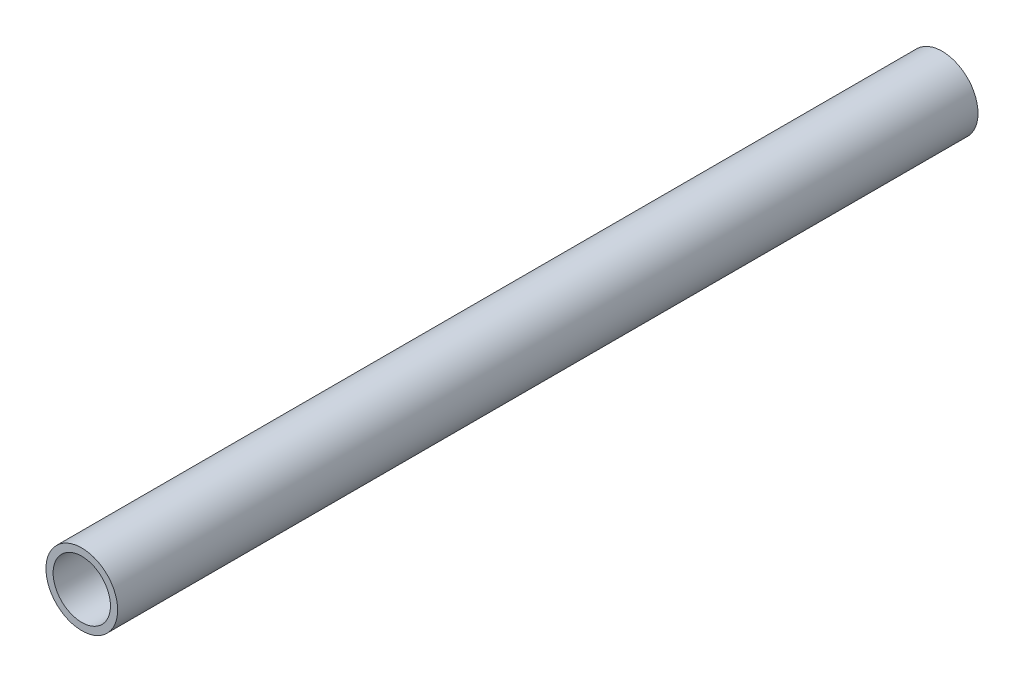
ISO-10303-21;
HEADER;
FILE_DESCRIPTION(('STEP AP214'),'2;1');
FILE_NAME('part.step','',(''),(''),'','','');
FILE_SCHEMA(('AUTOMOTIVE_DESIGN { 1 0 10303 214 1 1 1 1 }'));
ENDSEC;
DATA;
#1=APPLICATION_CONTEXT('core data for automotive mechanical design processes');
#2=APPLICATION_PROTOCOL_DEFINITION('international standard','automotive_design',2000,#1);
#3=PRODUCT_CONTEXT('',#1,'mechanical');
#4=PRODUCT('Part','Part','',(#3));
#5=PRODUCT_RELATED_PRODUCT_CATEGORY('part','',(#4));
#6=PRODUCT_DEFINITION_FORMATION('','',#4);
#7=PRODUCT_DEFINITION_CONTEXT('part definition',#1,'design');
#8=PRODUCT_DEFINITION('design','',#6,#7);
#9=PRODUCT_DEFINITION_SHAPE('','',#8);
#10=(LENGTH_UNIT() NAMED_UNIT(*) SI_UNIT(.MILLI.,.METRE.));
#11=(NAMED_UNIT(*) PLANE_ANGLE_UNIT() SI_UNIT($,.RADIAN.));
#12=(NAMED_UNIT(*) SI_UNIT($,.STERADIAN.) SOLID_ANGLE_UNIT());
#13=UNCERTAINTY_MEASURE_WITH_UNIT(LENGTH_MEASURE(1.E-05),#10,'distance_accuracy_value','');
#14=(GEOMETRIC_REPRESENTATION_CONTEXT(3) GLOBAL_UNCERTAINTY_ASSIGNED_CONTEXT((#13)) GLOBAL_UNIT_ASSIGNED_CONTEXT((#10,
#11,#12)) REPRESENTATION_CONTEXT('',''));
#15=CARTESIAN_POINT('',(0.,0.,0.));
#16=DIRECTION('',(0.,0.,1.));
#17=DIRECTION('',(1.,0.,0.));
#18=AXIS2_PLACEMENT_3D('',#15,#16,#17);
#19=CARTESIAN_POINT('',(0.,0.,120.));
#20=DIRECTION('',(0.,0.,1.));
#21=DIRECTION('',(1.,0.,0.));
#22=AXIS2_PLACEMENT_3D('',#19,#20,#21);
#23=PLANE('',#22);
#24=CARTESIAN_POINT('',(0.,0.,120.));
#25=DIRECTION('',(0.,0.,1.));
#26=DIRECTION('',(1.,0.,0.));
#27=AXIS2_PLACEMENT_3D('',#24,#25,#26);
#28=CIRCLE('',#27,5.);
#29=CARTESIAN_POINT('',(5.,0.,120.));
#30=VERTEX_POINT('',#29);
#31=EDGE_CURVE('E10',#30,#30,#28,.T.);
#32=ORIENTED_EDGE('',*,*,#31,.T.);
#33=EDGE_LOOP('',(#32));
#34=FACE_BOUND('',#33,.T.);
#35=CARTESIAN_POINT('',(0.,0.,120.));
#36=DIRECTION('',(0.,0.,1.));
#37=DIRECTION('',(1.,0.,0.));
#38=AXIS2_PLACEMENT_3D('',#35,#36,#37);
#39=CIRCLE('',#38,4.);
#40=CARTESIAN_POINT('',(4.,0.,120.));
#41=VERTEX_POINT('',#40);
#42=EDGE_CURVE('E52',#41,#41,#39,.T.);
#43=ORIENTED_EDGE('',*,*,#42,.F.);
#44=EDGE_LOOP('',(#43));
#45=FACE_BOUND('',#44,.T.);
#46=ADVANCED_FACE('F39',(#34,#45),#23,.T.);
#47=CARTESIAN_POINT('',(0.,0.,0.));
#48=DIRECTION('',(0.,0.,1.));
#49=DIRECTION('',(1.,0.,0.));
#50=AXIS2_PLACEMENT_3D('',#47,#48,#49);
#51=PLANE('',#50);
#52=CARTESIAN_POINT('',(0.,0.,0.));
#53=DIRECTION('',(0.,0.,1.));
#54=DIRECTION('',(1.,0.,0.));
#55=AXIS2_PLACEMENT_3D('',#52,#53,#54);
#56=CIRCLE('',#55,5.);
#57=CARTESIAN_POINT('',(5.,0.,0.));
#58=VERTEX_POINT('',#57);
#59=EDGE_CURVE('E43',#58,#58,#56,.T.);
#60=ORIENTED_EDGE('',*,*,#59,.F.);
#61=EDGE_LOOP('',(#60));
#62=FACE_BOUND('',#61,.T.);
#63=CARTESIAN_POINT('',(0.,0.,0.));
#64=DIRECTION('',(0.,0.,1.));
#65=DIRECTION('',(1.,0.,0.));
#66=AXIS2_PLACEMENT_3D('',#63,#64,#65);
#67=CIRCLE('',#66,4.);
#68=CARTESIAN_POINT('',(4.,0.,0.));
#69=VERTEX_POINT('',#68);
#70=EDGE_CURVE('E54',#69,#69,#67,.T.);
#71=ORIENTED_EDGE('',*,*,#70,.T.);
#72=EDGE_LOOP('',(#71));
#73=FACE_BOUND('',#72,.T.);
#74=ADVANCED_FACE('F66',(#62,#73),#51,.F.);
#75=CARTESIAN_POINT('',(0.,0.,120.));
#76=DIRECTION('',(0.,0.,-1.));
#77=DIRECTION('',(-1.,0.,0.));
#78=AXIS2_PLACEMENT_3D('',#75,#76,#77);
#79=CYLINDRICAL_SURFACE('',#78,5.);
#80=ORIENTED_EDGE('',*,*,#31,.F.);
#81=EDGE_LOOP('',(#80));
#82=FACE_BOUND('',#81,.T.);
#83=ORIENTED_EDGE('',*,*,#59,.T.);
#84=EDGE_LOOP('',(#83));
#85=FACE_BOUND('',#84,.T.);
#86=ADVANCED_FACE('F41',(#82,#85),#79,.T.);
#87=CARTESIAN_POINT('',(0.,0.,120.));
#88=DIRECTION('',(0.,0.,-1.));
#89=DIRECTION('',(-1.,0.,0.));
#90=AXIS2_PLACEMENT_3D('',#87,#88,#89);
#91=CYLINDRICAL_SURFACE('',#90,4.);
#92=ORIENTED_EDGE('',*,*,#42,.T.);
#93=EDGE_LOOP('',(#92));
#94=FACE_BOUND('',#93,.T.);
#95=ORIENTED_EDGE('',*,*,#70,.F.);
#96=EDGE_LOOP('',(#95));
#97=FACE_BOUND('',#96,.T.);
#98=ADVANCED_FACE('F62',(#94,#97),#91,.F.);
#99=CLOSED_SHELL('',(#46,#74,#86,#98));
#100=MANIFOLD_SOLID_BREP('B2',#99);
#101=ADVANCED_BREP_SHAPE_REPRESENTATION('',(#18,#100),#14);
#102=SHAPE_DEFINITION_REPRESENTATION(#9,#101);
ENDSEC;
END-ISO-10303-21;
